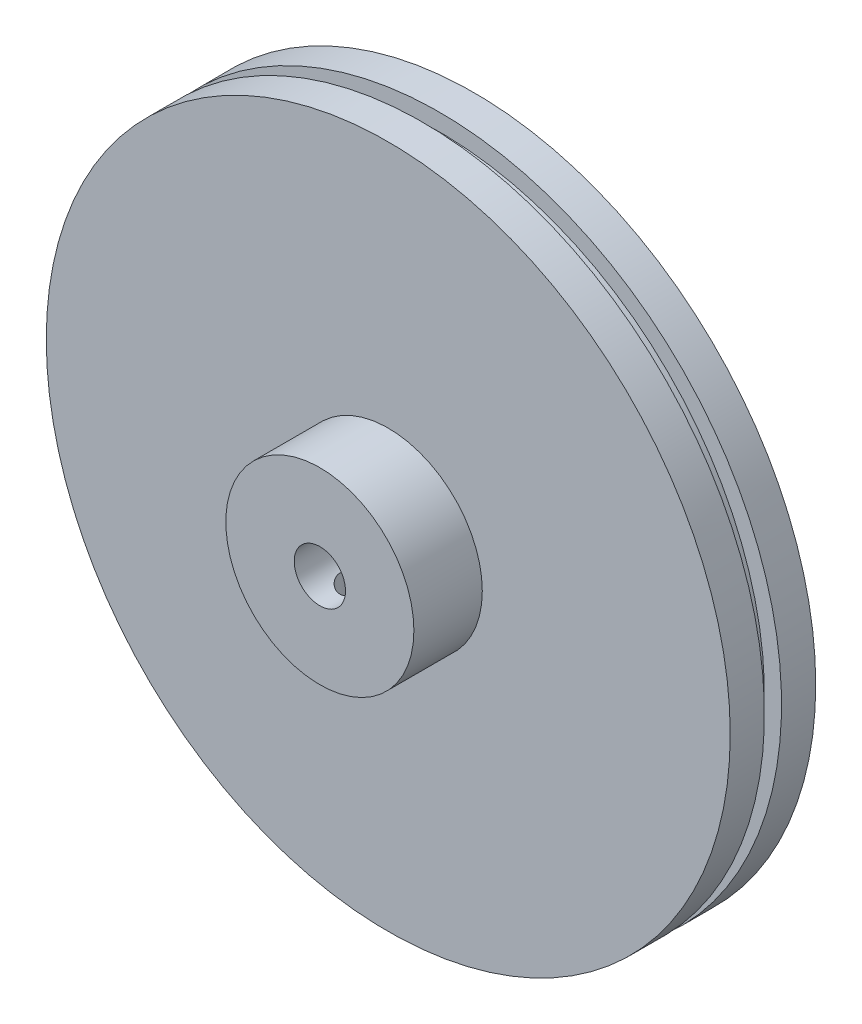
ISO-10303-21;
HEADER;
FILE_DESCRIPTION(('STEP AP214'),'2;1');
FILE_NAME('part.step','',(''),(''),'','','');
FILE_SCHEMA(('AUTOMOTIVE_DESIGN { 1 0 10303 214 1 1 1 1 }'));
ENDSEC;
DATA;
#1=APPLICATION_CONTEXT('core data for automotive mechanical design processes');
#2=APPLICATION_PROTOCOL_DEFINITION('international standard','automotive_design',2000,#1);
#3=PRODUCT_CONTEXT('',#1,'mechanical');
#4=PRODUCT('Part','Part','',(#3));
#5=PRODUCT_RELATED_PRODUCT_CATEGORY('part','',(#4));
#6=PRODUCT_DEFINITION_FORMATION('','',#4);
#7=PRODUCT_DEFINITION_CONTEXT('part definition',#1,'design');
#8=PRODUCT_DEFINITION('design','',#6,#7);
#9=PRODUCT_DEFINITION_SHAPE('','',#8);
#10=(LENGTH_UNIT() NAMED_UNIT(*) SI_UNIT(.MILLI.,.METRE.));
#11=(NAMED_UNIT(*) PLANE_ANGLE_UNIT() SI_UNIT($,.RADIAN.));
#12=(NAMED_UNIT(*) SI_UNIT($,.STERADIAN.) SOLID_ANGLE_UNIT());
#13=UNCERTAINTY_MEASURE_WITH_UNIT(LENGTH_MEASURE(1.E-05),#10,'distance_accuracy_value','');
#14=(GEOMETRIC_REPRESENTATION_CONTEXT(3) GLOBAL_UNCERTAINTY_ASSIGNED_CONTEXT((#13)) GLOBAL_UNIT_ASSIGNED_CONTEXT((#10,
#11,#12)) REPRESENTATION_CONTEXT('',''));
#15=CARTESIAN_POINT('',(0.,0.,0.));
#16=DIRECTION('',(0.,0.,1.));
#17=DIRECTION('',(1.,0.,0.));
#18=AXIS2_PLACEMENT_3D('',#15,#16,#17);
#19=CARTESIAN_POINT('',(0.,0.,10.));
#20=DIRECTION('',(0.,0.,-1.));
#21=DIRECTION('',(-1.,0.,0.));
#22=AXIS2_PLACEMENT_3D('',#19,#20,#21);
#23=CYLINDRICAL_SURFACE('',#22,40.);
#24=CARTESIAN_POINT('',(0.,0.,10.));
#25=DIRECTION('',(0.,0.,1.));
#26=DIRECTION('',(1.,0.,0.));
#27=AXIS2_PLACEMENT_3D('',#24,#25,#26);
#28=CIRCLE('',#27,40.);
#29=CARTESIAN_POINT('',(40.,0.,10.));
#30=VERTEX_POINT('',#29);
#31=EDGE_CURVE('E84',#30,#30,#28,.T.);
#32=ORIENTED_EDGE('',*,*,#31,.F.);
#33=EDGE_LOOP('',(#32));
#34=FACE_BOUND('',#33,.T.);
#35=CARTESIAN_POINT('',(0.,0.,6.));
#36=DIRECTION('',(0.,0.,-1.));
#37=DIRECTION('',(-1.,0.,0.));
#38=AXIS2_PLACEMENT_3D('',#35,#36,#37);
#39=CIRCLE('',#38,40.);
#40=CARTESIAN_POINT('',(-40.,0.,6.));
#41=VERTEX_POINT('',#40);
#42=EDGE_CURVE('E96',#41,#41,#39,.T.);
#43=ORIENTED_EDGE('',*,*,#42,.F.);
#44=EDGE_LOOP('',(#43));
#45=FACE_BOUND('',#44,.T.);
#46=ADVANCED_FACE('F76',(#34,#45),#23,.T.);
#47=CARTESIAN_POINT('',(0.,0.,4.));
#48=DIRECTION('',(0.,0.,-1.));
#49=DIRECTION('',(-1.,0.,0.));
#50=AXIS2_PLACEMENT_3D('',#47,#48,#49);
#51=CIRCLE('',#50,40.);
#52=CARTESIAN_POINT('',(-40.,0.,4.));
#53=VERTEX_POINT('',#52);
#54=EDGE_CURVE('E80',#53,#53,#51,.T.);
#55=ORIENTED_EDGE('',*,*,#54,.T.);
#56=EDGE_LOOP('',(#55));
#57=FACE_BOUND('',#56,.T.);
#58=CARTESIAN_POINT('',(0.,0.,0.));
#59=DIRECTION('',(0.,0.,1.));
#60=DIRECTION('',(1.,0.,0.));
#61=AXIS2_PLACEMENT_3D('',#58,#59,#60);
#62=CIRCLE('',#61,40.);
#63=CARTESIAN_POINT('',(40.,0.,0.));
#64=VERTEX_POINT('',#63);
#65=EDGE_CURVE('E89',#64,#64,#62,.T.);
#66=ORIENTED_EDGE('',*,*,#65,.T.);
#67=EDGE_LOOP('',(#66));
#68=FACE_BOUND('',#67,.T.);
#69=ADVANCED_FACE('F78',(#57,#68),#23,.T.);
#70=CARTESIAN_POINT('',(0.,0.,10.));
#71=DIRECTION('',(0.,0.,1.));
#72=DIRECTION('',(1.,0.,0.));
#73=AXIS2_PLACEMENT_3D('',#70,#71,#72);
#74=PLANE('',#73);
#75=CARTESIAN_POINT('',(0.,0.,10.));
#76=DIRECTION('',(0.,0.,1.));
#77=DIRECTION('',(1.,0.,0.));
#78=AXIS2_PLACEMENT_3D('',#75,#76,#77);
#79=CIRCLE('',#78,11.);
#80=CARTESIAN_POINT('',(11.,0.,10.));
#81=VERTEX_POINT('',#80);
#82=EDGE_CURVE('E12',#81,#81,#79,.T.);
#83=ORIENTED_EDGE('',*,*,#82,.F.);
#84=EDGE_LOOP('',(#83));
#85=FACE_BOUND('',#84,.T.);
#86=ORIENTED_EDGE('',*,*,#31,.T.);
#87=EDGE_LOOP('',(#86));
#88=FACE_BOUND('',#87,.T.);
#89=ADVANCED_FACE('F152',(#85,#88),#74,.T.);
#90=CARTESIAN_POINT('',(0.,0.,0.));
#91=DIRECTION('',(0.,0.,1.));
#92=DIRECTION('',(1.,0.,0.));
#93=AXIS2_PLACEMENT_3D('',#90,#91,#92);
#94=PLANE('',#93);
#95=CARTESIAN_POINT('',(0.,0.,0.));
#96=DIRECTION('',(0.,0.,1.));
#97=DIRECTION('',(1.,0.,0.));
#98=AXIS2_PLACEMENT_3D('',#95,#96,#97);
#99=CIRCLE('',#98,3.);
#100=CARTESIAN_POINT('',(3.,0.,0.));
#101=VERTEX_POINT('',#100);
#102=EDGE_CURVE('E183',#101,#101,#99,.T.);
#103=ORIENTED_EDGE('',*,*,#102,.T.);
#104=EDGE_LOOP('',(#103));
#105=FACE_BOUND('',#104,.T.);
#106=ORIENTED_EDGE('',*,*,#65,.F.);
#107=EDGE_LOOP('',(#106));
#108=FACE_BOUND('',#107,.T.);
#109=ADVANCED_FACE('F158',(#105,#108),#94,.F.);
#110=CARTESIAN_POINT('',(0.,0.,18.));
#111=DIRECTION('',(0.,0.,-1.));
#112=DIRECTION('',(-1.,0.,0.));
#113=AXIS2_PLACEMENT_3D('',#110,#111,#112);
#114=CYLINDRICAL_SURFACE('',#113,11.);
#115=CARTESIAN_POINT('',(0.,-11.,12.35));
#116=CARTESIAN_POINT('',(-0.0921266989298058,-10.9999985234843,12.3500037991968));
#117=CARTESIAN_POINT('',(-0.184306853590344,-10.9988305079074,12.3577418009247));
#118=CARTESIAN_POINT('',(-0.366090590794402,-10.9942834757051,12.388481519981));
#119=CARTESIAN_POINT('',(-0.45569157587165,-10.9909023063232,12.4114980992394));
#120=CARTESIAN_POINT('',(-0.629659894844043,-10.9823089334148,12.4720917554644));
#121=CARTESIAN_POINT('',(-0.714031128609475,-10.9770981140801,12.5096578274566));
#122=CARTESIAN_POINT('',(-0.875259471498775,-10.965421235029,12.5982572173586));
#123=CARTESIAN_POINT('',(-0.952117622197703,-10.9589553496805,12.6492886648591));
#124=CARTESIAN_POINT('',(-1.09675139151833,-10.945430880906,12.7637949914339));
#125=CARTESIAN_POINT('',(-1.16445981544804,-10.9383684727936,12.827354301829));
#126=CARTESIAN_POINT('',(-1.28829239735843,-10.9244768724656,12.9649304577833));
#127=CARTESIAN_POINT('',(-1.34441588900229,-10.9176476936836,13.0389479044564));
#128=CARTESIAN_POINT('',(-1.44374702449937,-10.904958652046,13.1957907078747));
#129=CARTESIAN_POINT('',(-1.48688965740925,-10.8991037317253,13.2786576716795));
#130=CARTESIAN_POINT('',(-1.55861895388161,-10.8890783243689,13.45056410271));
#131=CARTESIAN_POINT('',(-1.58720641078079,-10.8849077455299,13.5396032332183));
#132=CARTESIAN_POINT('',(-1.62880518678801,-10.8787608184054,13.7206198460589));
#133=CARTESIAN_POINT('',(-1.64193154004569,-10.8767682731538,13.8125703327488));
#134=CARTESIAN_POINT('',(-1.65259186437325,-10.8751538386764,13.997388782586));
#135=CARTESIAN_POINT('',(-1.65012673071175,-10.8755318133346,14.0902566927487));
#136=CARTESIAN_POINT('',(-1.62976806575866,-10.8786009018765,14.2734611882136));
#137=CARTESIAN_POINT('',(-1.61200265520525,-10.881272806377,14.3638123791333));
#138=CARTESIAN_POINT('',(-1.56174829144107,-10.88859868939,14.5402368057587));
#139=CARTESIAN_POINT('',(-1.52925892171593,-10.8932527239732,14.6263099203688));
#140=CARTESIAN_POINT('',(-1.4503456388271,-10.9040396910003,14.7921247084111));
#141=CARTESIAN_POINT('',(-1.40386745711517,-10.9101783644318,14.8718401660016));
#142=CARTESIAN_POINT('',(-1.2983345444185,-10.92323878332,15.0223890553601));
#143=CARTESIAN_POINT('',(-1.23927898800726,-10.9301605801575,15.0932219036963));
#144=CARTESIAN_POINT('',(-1.10956442386072,-10.9440922036183,15.2247374268137));
#145=CARTESIAN_POINT('',(-1.0387952626062,-10.951102218241,15.285311489315));
#146=CARTESIAN_POINT('',(-0.888037798883601,-10.9643561241331,15.393739527958));
#147=CARTESIAN_POINT('',(-0.808049456046984,-10.9706000120476,15.4415934483983));
#148=CARTESIAN_POINT('',(-0.641030058035052,-10.9816246714393,15.5232283951495));
#149=CARTESIAN_POINT('',(-0.553994845620456,-10.9864045711797,15.5570010410243));
#150=CARTESIAN_POINT('',(-0.375400500735766,-10.9939553961278,15.6094203286539));
#151=CARTESIAN_POINT('',(-0.28384167454786,-10.9967264571501,15.6280679929971));
#152=CARTESIAN_POINT('',(-0.0997365244080116,-10.9999293924726,15.6495635527984));
#153=CARTESIAN_POINT('',(-0.00720800505751849,-11.0003833729943,15.6525607685172));
#154=CARTESIAN_POINT('',(0.177030345428509,-10.9989611711675,15.6430666941579));
#155=CARTESIAN_POINT('',(0.268740201820063,-10.9970850609551,15.6305758835651));
#156=CARTESIAN_POINT('',(0.448285626174546,-10.9912271547687,15.5905844898047));
#157=CARTESIAN_POINT('',(0.536137759387819,-10.9872555672878,15.5631566543661));
#158=CARTESIAN_POINT('',(0.705996454507296,-10.9776505922421,15.4941465027921));
#159=CARTESIAN_POINT('',(0.788002741674606,-10.9720171266372,15.452563521933));
#160=CARTESIAN_POINT('',(0.944498477221108,-10.9596595071555,15.3560731529798));
#161=CARTESIAN_POINT('',(1.01892891088072,-10.9529277178942,15.3010710459859));
#162=CARTESIAN_POINT('',(1.15755604049547,-10.9391464931338,15.1794356072084));
#163=CARTESIAN_POINT('',(1.22175214127274,-10.9320970391915,15.1128015994429));
#164=CARTESIAN_POINT('',(1.33863163452914,-10.9184049073494,14.9691291135059));
#165=CARTESIAN_POINT('',(1.39121493222162,-10.9117660961935,14.8920087822858));
#166=CARTESIAN_POINT('',(1.48268042197642,-10.8997154101539,14.7299423554371));
#167=CARTESIAN_POINT('',(1.52156298422079,-10.8943035021219,14.6449964713264));
#168=CARTESIAN_POINT('',(1.58436814056337,-10.8853473630951,14.4699887130146));
#169=CARTESIAN_POINT('',(1.60834340855798,-10.8817965630708,14.3799460929316));
#170=CARTESIAN_POINT('',(1.64082104451744,-10.8769472052758,14.1970550830214));
#171=CARTESIAN_POINT('',(1.64932448101372,-10.8756484919695,14.1042068874059));
#172=CARTESIAN_POINT('',(1.65059165336383,-10.8754561587193,13.9193380303526));
#173=CARTESIAN_POINT('',(1.64351277384043,-10.8765384896685,13.8273184340674));
#174=CARTESIAN_POINT('',(1.61415352498816,-10.8809340267229,13.6457942103441));
#175=CARTESIAN_POINT('',(1.59187318002489,-10.8842472292523,13.5562895788753));
#176=CARTESIAN_POINT('',(1.53279910870531,-10.8927227872353,13.3823796095422));
#177=CARTESIAN_POINT('',(1.49601638256745,-10.8978837408768,13.2979704625232));
#178=CARTESIAN_POINT('',(1.40899734406539,-10.9094750001347,13.1364960028174));
#179=CARTESIAN_POINT('',(1.35876057615652,-10.91590534873,13.059430938916));
#180=CARTESIAN_POINT('',(1.2456877142508,-10.9293881770143,12.9140326362273));
#181=CARTESIAN_POINT('',(1.18273505943786,-10.9364460467016,12.8457905334282));
#182=CARTESIAN_POINT('',(1.04626372519111,-10.950343677093,12.7207829897334));
#183=CARTESIAN_POINT('',(0.972742593186032,-10.9571833867183,12.6640202201662));
#184=CARTESIAN_POINT('',(0.816745278298091,-10.9699170436957,12.5633035557319));
#185=CARTESIAN_POINT('',(0.734222034441233,-10.975805578417,12.5194218798638));
#186=CARTESIAN_POINT('',(0.562927057273589,-10.9859203168326,12.4462076315662));
#187=CARTESIAN_POINT('',(0.474161904806373,-10.9901482412233,12.4168599909409));
#188=CARTESIAN_POINT('',(0.320832300678261,-10.9955003318766,12.3802045230189));
#189=CARTESIAN_POINT('',(0.257214246844805,-10.9971790409751,12.3688951383073));
#190=CARTESIAN_POINT('',(0.129072868760137,-10.9994293854269,12.3537915925161));
#191=CARTESIAN_POINT('',(0.0645495557678586,-11.0000010345365,12.3499973380522));
#192=CARTESIAN_POINT('',(0.,-11.,12.35));
#193=B_SPLINE_CURVE_WITH_KNOTS('',3,(#115,#116,#117,#118,#119,#120,#121,#122,#123,#124,#125,
#126,#127,#128,#129,#130,#131,#132,#133,#134,#135,#136,#137,#138,#139,#140,#141,#142,#143,#144,
#145,#146,#147,#148,#149,#150,#151,#152,#153,#154,#155,#156,#157,#158,#159,#160,#161,#162,#163,
#164,#165,#166,#167,#168,#169,#170,#171,#172,#173,#174,#175,#176,#177,#178,#179,#180,#181,#182,
#183,#184,#185,#186,#187,#188,#189,#190,#191,#192),.UNSPECIFIED.,.T.,.F.,(4,2,2,2,2,2,2,2,2,2,2,
2,2,2,2,2,2,2,2,2,2,2,2,2,2,2,2,2,2,2,2,2,2,2,2,2,2,2,4),(0.,0.276144225534828,
0.552557459222063,0.828762025941556,1.10492824661735,1.38302357750527,1.66113489929837,
1.94061672634911,2.22008331848056,2.49745721066516,2.77481517608879,3.0498729491532,
3.32493850359396,3.60108521823773,3.87725006139386,4.15617720380948,4.43510556762533,
4.7141996988336,4.99327495912739,5.26968264398678,5.54608177190268,5.8211466386254,
6.09622442413898,6.37330306840595,6.65039782031489,6.92979503243136,7.20918469489712,
7.48758145802881,7.7659589935089,8.04153777087167,8.31711610652516,8.59248581382557,
8.86786484613563,9.14589312962288,9.42398603815602,9.70360955723202,9.98294256587581,
10.1764283717668,10.3699117733562),.UNSPECIFIED.);
#194=CARTESIAN_POINT('',(0.,-11.,12.35));
#195=VERTEX_POINT('',#194);
#196=EDGE_CURVE('E118',#195,#195,#193,.T.);
#197=ORIENTED_EDGE('',*,*,#196,.T.);
#198=EDGE_LOOP('',(#197));
#199=FACE_BOUND('',#198,.T.);
#200=CARTESIAN_POINT('',(0.,0.,18.));
#201=DIRECTION('',(0.,0.,1.));
#202=DIRECTION('',(1.,0.,0.));
#203=AXIS2_PLACEMENT_3D('',#200,#201,#202);
#204=CIRCLE('',#203,11.);
#205=CARTESIAN_POINT('',(11.,0.,18.));
#206=VERTEX_POINT('',#205);
#207=EDGE_CURVE('E92',#206,#206,#204,.T.);
#208=ORIENTED_EDGE('',*,*,#207,.F.);
#209=EDGE_LOOP('',(#208));
#210=FACE_BOUND('',#209,.T.);
#211=ORIENTED_EDGE('',*,*,#82,.T.);
#212=EDGE_LOOP('',(#211));
#213=FACE_BOUND('',#212,.T.);
#214=ADVANCED_FACE('F164',(#199,#210,#213),#114,.T.);
#215=CARTESIAN_POINT('',(0.,0.,18.));
#216=DIRECTION('',(0.,0.,1.));
#217=DIRECTION('',(1.,0.,0.));
#218=AXIS2_PLACEMENT_3D('',#215,#216,#217);
#219=PLANE('',#218);
#220=CARTESIAN_POINT('',(0.,0.,18.));
#221=DIRECTION('',(0.,0.,1.));
#222=DIRECTION('',(1.,0.,0.));
#223=AXIS2_PLACEMENT_3D('',#220,#221,#222);
#224=CIRCLE('',#223,3.);
#225=CARTESIAN_POINT('',(3.,0.,18.));
#226=VERTEX_POINT('',#225);
#227=EDGE_CURVE('E186',#226,#226,#224,.T.);
#228=ORIENTED_EDGE('',*,*,#227,.F.);
#229=EDGE_LOOP('',(#228));
#230=FACE_BOUND('',#229,.T.);
#231=ORIENTED_EDGE('',*,*,#207,.T.);
#232=EDGE_LOOP('',(#231));
#233=FACE_BOUND('',#232,.T.);
#234=ADVANCED_FACE('F169',(#230,#233),#219,.T.);
#235=CARTESIAN_POINT('',(0.,0.,0.));
#236=DIRECTION('',(0.,0.,1.));
#237=DIRECTION('',(1.,0.,0.));
#238=AXIS2_PLACEMENT_3D('',#235,#236,#237);
#239=CYLINDRICAL_SURFACE('',#238,3.);
#240=CARTESIAN_POINT('',(0.,-3.,12.35));
#241=CARTESIAN_POINT('',(0.0856699475452992,-2.99999513886583,12.3500053833783));
#242=CARTESIAN_POINT('',(0.171409071205646,-2.99629302255545,12.356710645591));
#243=CARTESIAN_POINT('',(0.340286051726046,-2.9818478399119,12.3832022152304));
#244=CARTESIAN_POINT('',(0.423420195379859,-2.97109516282085,12.403006378348));
#245=CARTESIAN_POINT('',(0.584401577928635,-2.9436571869529,12.4546544643217));
#246=CARTESIAN_POINT('',(0.662269062667417,-2.9269963495649,12.4864487786297));
#247=CARTESIAN_POINT('',(0.81140824063576,-2.8892116252981,12.560878668174));
#248=CARTESIAN_POINT('',(0.88267965189667,-2.86808754775153,12.6035147065801));
#249=CARTESIAN_POINT('',(1.02211619357275,-2.82153252993505,12.7017153331246));
#250=CARTESIAN_POINT('',(1.0897303734279,-2.79590528013302,12.7579675244442));
#251=CARTESIAN_POINT('',(1.21508634233516,-2.74375354722835,12.8802916084601));
#252=CARTESIAN_POINT('',(1.27281890234559,-2.71722825277821,12.9463725743695));
#253=CARTESIAN_POINT('',(1.38251917690996,-2.66321895829991,13.0942259859227));
#254=CARTESIAN_POINT('',(1.43335857713386,-2.63589796579201,13.1769029614847));
#255=CARTESIAN_POINT('',(1.52021547735939,-2.58678336476684,13.3512273656326));
#256=CARTESIAN_POINT('',(1.5562446891168,-2.56498539395023,13.4428676348573));
#257=CARTESIAN_POINT('',(1.60989890926138,-2.53163475086558,13.6267694484273));
#258=CARTESIAN_POINT('',(1.62854263347078,-2.51952192354843,13.7186261534528));
#259=CARTESIAN_POINT('',(1.64991120631134,-2.50558905633891,13.9048894485567));
#260=CARTESIAN_POINT('',(1.65265887915296,-2.50375425894472,13.999292187024));
#261=CARTESIAN_POINT('',(1.64290000078863,-2.51015646726158,14.1724283567496));
#262=CARTESIAN_POINT('',(1.63265157443423,-2.51690299364892,14.2513597584993));
#263=CARTESIAN_POINT('',(1.60118639026893,-2.53703527550373,14.4061294199033));
#264=CARTESIAN_POINT('',(1.57996463656909,-2.55042405491467,14.4819662536941));
#265=CARTESIAN_POINT('',(1.52687641342514,-2.58256130946142,14.6304823200009));
#266=CARTESIAN_POINT('',(1.49479033069661,-2.60141910516922,14.7030582377923));
#267=CARTESIAN_POINT('',(1.42107429999087,-2.64240902469132,14.8421710205968));
#268=CARTESIAN_POINT('',(1.3794402325366,-2.66454256035722,14.9087052615819));
#269=CARTESIAN_POINT('',(1.28018349411555,-2.71379040847906,15.0448947835801));
#270=CARTESIAN_POINT('',(1.22107458392543,-2.74113957142577,15.1133860518844));
#271=CARTESIAN_POINT('',(1.09224532196501,-2.79497377887706,15.2400265806514));
#272=CARTESIAN_POINT('',(1.02251777065963,-2.82145822218593,15.2981687658924));
#273=CARTESIAN_POINT('',(0.86860504180093,-2.87272134052732,15.4062148266834));
#274=CARTESIAN_POINT('',(0.783763861453037,-2.89726648156192,15.4553046406289));
#275=CARTESIAN_POINT('',(0.605352377645228,-2.93971528365153,15.5380807534375));
#276=CARTESIAN_POINT('',(0.511790381195991,-2.95762518579738,15.5717815341667));
#277=CARTESIAN_POINT('',(0.327907037980976,-2.98333345624201,15.6196122104382));
#278=CARTESIAN_POINT('',(0.238095480523287,-2.99191822782612,15.6352725515175));
#279=CARTESIAN_POINT('',(0.0567325334425122,-3.00083376662002,15.6515308287069));
#280=CARTESIAN_POINT('',(-0.0348177069344358,-3.00116980828416,15.6521383899618));
#281=CARTESIAN_POINT('',(-0.207487375150859,-2.99394177831786,15.6389654866944));
#282=CARTESIAN_POINT('',(-0.288751776237441,-2.98714659587173,15.6265853987182));
#283=CARTESIAN_POINT('',(-0.447838849624849,-2.96746793830126,15.5901574026674));
#284=CARTESIAN_POINT('',(-0.525661172937911,-2.95458384737082,15.5661083144335));
#285=CARTESIAN_POINT('',(-0.677753407865903,-2.92349378037744,15.5066423840483));
#286=CARTESIAN_POINT('',(-0.751904240945376,-2.90517475144826,15.4709823044531));
#287=CARTESIAN_POINT('',(-0.893363199749702,-2.86484215103297,15.3896286537003));
#288=CARTESIAN_POINT('',(-0.960668811424105,-2.8428272299655,15.3439314155164));
#289=CARTESIAN_POINT('',(-1.09455456288909,-2.79420331593949,15.2379552858616));
#290=CARTESIAN_POINT('',(-1.16021004375817,-2.76735592347542,15.176616716341));
#291=CARTESIAN_POINT('',(-1.28079913012788,-2.71365440736755,15.0440755703225));
#292=CARTESIAN_POINT('',(-1.33572155748716,-2.6868003055646,14.9728628407176));
#293=CARTESIAN_POINT('',(-1.43747254066661,-2.63385875511374,14.8158358065929));
#294=CARTESIAN_POINT('',(-1.48334076829298,-2.60799295737884,14.7293169231246));
#295=CARTESIAN_POINT('',(-1.55942876653783,-2.56323063992908,14.5480059202913));
#296=CARTESIAN_POINT('',(-1.58967133039467,-2.54432398053561,14.4532260886001));
#297=CARTESIAN_POINT('',(-1.6306246255404,-2.51825420457376,14.2677376224145));
#298=CARTESIAN_POINT('',(-1.64294477567077,-2.51013022153209,14.1775252194605));
#299=CARTESIAN_POINT('',(-1.65249034912289,-2.50386093509844,13.995989530712));
#300=CARTESIAN_POINT('',(-1.64972872967261,-2.50570706604925,13.9046672657274));
#301=CARTESIAN_POINT('',(-1.63075691736924,-2.51807870697286,13.7367804784445));
#302=CARTESIAN_POINT('',(-1.61642825416934,-2.52738874118224,13.6598990264669));
#303=CARTESIAN_POINT('',(-1.57741079979875,-2.55192145753237,13.50980458104));
#304=CARTESIAN_POINT('',(-1.55271775279778,-2.56714656833463,13.4365931084));
#305=CARTESIAN_POINT('',(-1.49205611796199,-2.60289749299614,13.290860353707));
#306=CARTESIAN_POINT('',(-1.45548954002738,-2.62369085726805,13.2186560041008));
#307=CARTESIAN_POINT('',(-1.37268509596928,-2.66794671801683,13.0809239784997));
#308=CARTESIAN_POINT('',(-1.32644209751912,-2.69141062791392,13.0153998732133));
#309=CARTESIAN_POINT('',(-1.21715006880684,-2.74276036037727,12.8821502604447));
#310=CARTESIAN_POINT('',(-1.15260264369496,-2.77076245736401,12.8156917648167));
#311=CARTESIAN_POINT('',(-1.01279351012943,-2.82486614857147,12.6941155725779));
#312=CARTESIAN_POINT('',(-0.937524174112376,-2.85096636964492,12.639006018451));
#313=CARTESIAN_POINT('',(-0.774887264813817,-2.89948189270181,12.5400619660341));
#314=CARTESIAN_POINT('',(-0.687189892415582,-2.92173740350452,12.4966864355936));
#315=CARTESIAN_POINT('',(-0.504223640414887,-2.95878417900051,12.4258902856693));
#316=CARTESIAN_POINT('',(-0.408974898948844,-2.97359457153256,12.3984287522293));
#317=CARTESIAN_POINT('',(-0.260510618519067,-2.98911434756595,12.3698579419877));
#318=CARTESIAN_POINT('',(-0.208783056433917,-2.99318008334623,12.3624275679877));
#319=CARTESIAN_POINT('',(-0.10471227339959,-2.99862437594614,12.3524969871791));
#320=CARTESIAN_POINT('',(-0.0523690613485731,-3.00000297155585,12.3499967092023));
#321=CARTESIAN_POINT('',(0.,-3.,12.35));
#322=B_SPLINE_CURVE_WITH_KNOTS('',3,(#240,#241,#242,#243,#244,#245,#246,#247,#248,#249,#250,
#251,#252,#253,#254,#255,#256,#257,#258,#259,#260,#261,#262,#263,#264,#265,#266,#267,#268,#269,
#270,#271,#272,#273,#274,#275,#276,#277,#278,#279,#280,#281,#282,#283,#284,#285,#286,#287,#288,
#289,#290,#291,#292,#293,#294,#295,#296,#297,#298,#299,#300,#301,#302,#303,#304,#305,#306,#307,
#308,#309,#310,#311,#312,#313,#314,#315,#316,#317,#318,#319,#320,#321),.UNSPECIFIED.,.T.,.F.,(4,
2,2,2,2,2,2,2,2,2,2,2,2,2,2,2,2,2,2,2,2,2,2,2,2,2,2,2,2,2,2,2,2,2,2,2,2,2,2,2,4),(0.,
0.256799016537926,0.513948810602822,0.770046131883806,1.02615439574975,1.29988051794781,
1.57386091081863,1.87483382859251,2.1755682798451,2.45730761481343,2.73864231615319,
2.97715628850377,3.21577894619803,3.45954576386219,3.70341795322453,3.9857698226592,
4.26831398861795,4.56980790280868,4.87101750814849,5.14417314031285,5.41715410504552,
5.66345591892141,5.90978264803875,6.16164305576707,6.41359563296032,6.69375293580819,
6.97420047673713,7.2764362913265,7.57822997932254,7.85076329691244,8.1230625093144,
8.35830132419625,8.59363682764362,8.84338665158082,9.09326927891538,9.38234984684165,
9.67163710326647,9.97098879991464,10.2695674268337,10.4265480013941,10.5835263098519),.UNSPECIFIED.);
#323=CARTESIAN_POINT('',(0.,-3.,12.35));
#324=VERTEX_POINT('',#323);
#325=EDGE_CURVE('E102',#324,#324,#322,.T.);
#326=ORIENTED_EDGE('',*,*,#325,.T.);
#327=EDGE_LOOP('',(#326));
#328=FACE_BOUND('',#327,.T.);
#329=ORIENTED_EDGE('',*,*,#102,.F.);
#330=EDGE_LOOP('',(#329));
#331=FACE_BOUND('',#330,.T.);
#332=ORIENTED_EDGE('',*,*,#227,.T.);
#333=EDGE_LOOP('',(#332));
#334=FACE_BOUND('',#333,.T.);
#335=ADVANCED_FACE('F131',(#328,#331,#334),#239,.F.);
#336=CARTESIAN_POINT('',(0.,-11.,14.));
#337=DIRECTION('',(0.,-1.,0.));
#338=DIRECTION('',(0.,0.,-1.));
#339=AXIS2_PLACEMENT_3D('',#336,#337,#338);
#340=CYLINDRICAL_SURFACE('',#339,1.64999999999999);
#341=ORIENTED_EDGE('',*,*,#325,.F.);
#342=EDGE_LOOP('',(#341));
#343=FACE_BOUND('',#342,.T.);
#344=ORIENTED_EDGE('',*,*,#196,.F.);
#345=EDGE_LOOP('',(#344));
#346=FACE_BOUND('',#345,.T.);
#347=ADVANCED_FACE('F126',(#343,#346),#340,.F.);
#348=CARTESIAN_POINT('',(0.,0.,4.));
#349=DIRECTION('',(0.,0.,-1.));
#350=DIRECTION('',(-1.,0.,0.));
#351=AXIS2_PLACEMENT_3D('',#348,#349,#350);
#352=PLANE('',#351);
#353=CARTESIAN_POINT('',(0.,0.,4.));
#354=DIRECTION('',(0.,0.,-1.));
#355=DIRECTION('',(-1.,0.,0.));
#356=AXIS2_PLACEMENT_3D('',#353,#354,#355);
#357=CIRCLE('',#356,38.);
#358=CARTESIAN_POINT('',(-38.,0.,4.));
#359=VERTEX_POINT('',#358);
#360=EDGE_CURVE('E98',#359,#359,#357,.T.);
#361=ORIENTED_EDGE('',*,*,#360,.T.);
#362=EDGE_LOOP('',(#361));
#363=FACE_BOUND('',#362,.T.);
#364=ORIENTED_EDGE('',*,*,#54,.F.);
#365=EDGE_LOOP('',(#364));
#366=FACE_BOUND('',#365,.T.);
#367=ADVANCED_FACE('F130',(#363,#366),#352,.F.);
#368=CARTESIAN_POINT('',(0.,0.,6.));
#369=DIRECTION('',(0.,0.,-1.));
#370=DIRECTION('',(-1.,0.,0.));
#371=AXIS2_PLACEMENT_3D('',#368,#369,#370);
#372=PLANE('',#371);
#373=CARTESIAN_POINT('',(0.,0.,6.));
#374=DIRECTION('',(0.,0.,-1.));
#375=DIRECTION('',(-1.,0.,0.));
#376=AXIS2_PLACEMENT_3D('',#373,#374,#375);
#377=CIRCLE('',#376,38.);
#378=CARTESIAN_POINT('',(-38.,0.,6.));
#379=VERTEX_POINT('',#378);
#380=EDGE_CURVE('E104',#379,#379,#377,.T.);
#381=ORIENTED_EDGE('',*,*,#380,.F.);
#382=EDGE_LOOP('',(#381));
#383=FACE_BOUND('',#382,.T.);
#384=ORIENTED_EDGE('',*,*,#42,.T.);
#385=EDGE_LOOP('',(#384));
#386=FACE_BOUND('',#385,.T.);
#387=ADVANCED_FACE('F136',(#383,#386),#372,.T.);
#388=CARTESIAN_POINT('',(0.,0.,4.));
#389=DIRECTION('',(0.,0.,1.));
#390=DIRECTION('',(1.,0.,0.));
#391=AXIS2_PLACEMENT_3D('',#388,#389,#390);
#392=CYLINDRICAL_SURFACE('',#391,38.);
#393=ORIENTED_EDGE('',*,*,#360,.F.);
#394=EDGE_LOOP('',(#393));
#395=FACE_BOUND('',#394,.T.);
#396=ORIENTED_EDGE('',*,*,#380,.T.);
#397=EDGE_LOOP('',(#396));
#398=FACE_BOUND('',#397,.T.);
#399=ADVANCED_FACE('F137',(#395,#398),#392,.T.);
#400=CLOSED_SHELL('',(#46,#69,#89,#109,#214,#234,#335,#347,#367,#387,#399));
#401=MANIFOLD_SOLID_BREP('B2',#400);
#402=ADVANCED_BREP_SHAPE_REPRESENTATION('',(#18,#401),#14);
#403=SHAPE_DEFINITION_REPRESENTATION(#9,#402);
ENDSEC;
END-ISO-10303-21;
